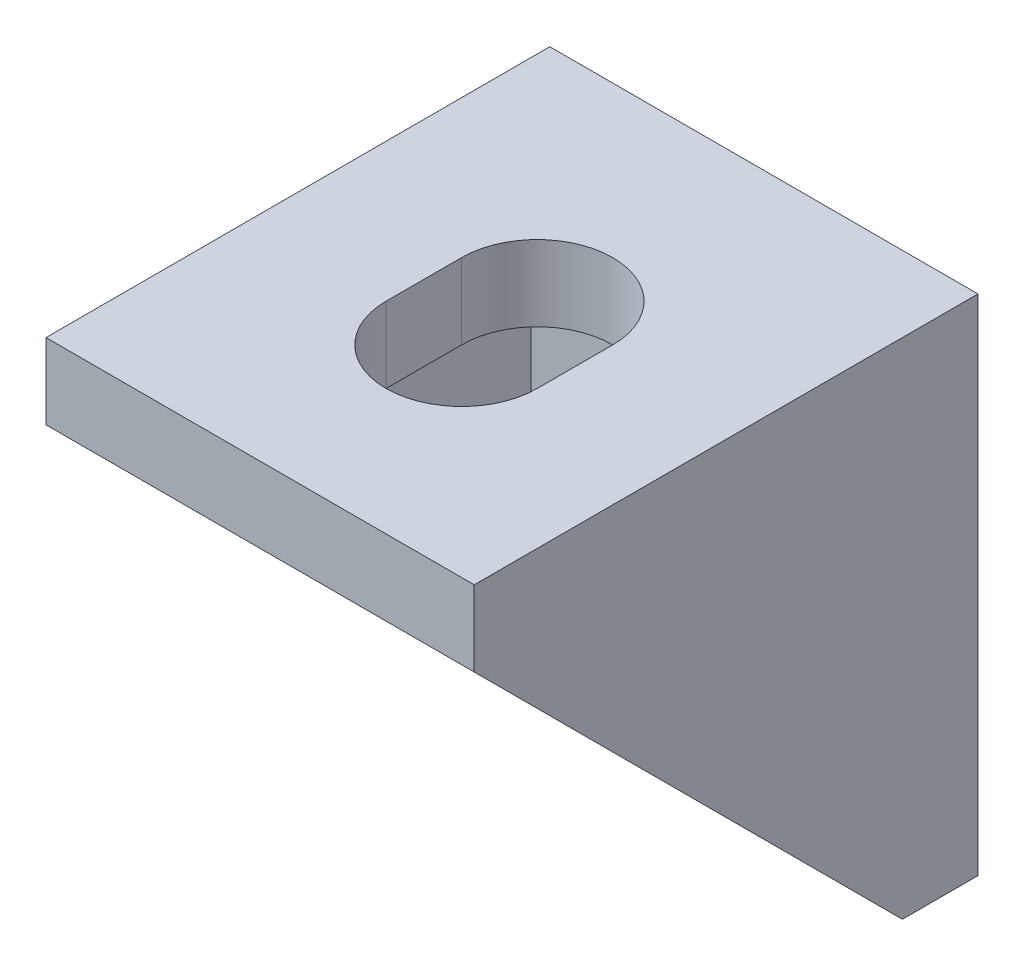
ISO-10303-21;
HEADER;
FILE_DESCRIPTION(('STEP AP214'),'2;1');
FILE_NAME('part.step','',(''),(''),'','','');
FILE_SCHEMA(('AUTOMOTIVE_DESIGN { 1 0 10303 214 1 1 1 1 }'));
ENDSEC;
DATA;
#1=APPLICATION_CONTEXT('core data for automotive mechanical design processes');
#2=APPLICATION_PROTOCOL_DEFINITION('international standard','automotive_design',2000,#1);
#3=PRODUCT_CONTEXT('',#1,'mechanical');
#4=PRODUCT('Part','Part','',(#3));
#5=PRODUCT_RELATED_PRODUCT_CATEGORY('part','',(#4));
#6=PRODUCT_DEFINITION_FORMATION('','',#4);
#7=PRODUCT_DEFINITION_CONTEXT('part definition',#1,'design');
#8=PRODUCT_DEFINITION('design','',#6,#7);
#9=PRODUCT_DEFINITION_SHAPE('','',#8);
#10=(LENGTH_UNIT() NAMED_UNIT(*) SI_UNIT(.MILLI.,.METRE.));
#11=(NAMED_UNIT(*) PLANE_ANGLE_UNIT() SI_UNIT($,.RADIAN.));
#12=(NAMED_UNIT(*) SI_UNIT($,.STERADIAN.) SOLID_ANGLE_UNIT());
#13=UNCERTAINTY_MEASURE_WITH_UNIT(LENGTH_MEASURE(1.E-05),#10,'distance_accuracy_value','');
#14=(GEOMETRIC_REPRESENTATION_CONTEXT(3) GLOBAL_UNCERTAINTY_ASSIGNED_CONTEXT((#13)) GLOBAL_UNIT_ASSIGNED_CONTEXT((#10,
#11,#12)) REPRESENTATION_CONTEXT('',''));
#15=CARTESIAN_POINT('',(0.,0.,0.));
#16=DIRECTION('',(0.,0.,1.));
#17=DIRECTION('',(1.,0.,0.));
#18=AXIS2_PLACEMENT_3D('',#15,#16,#17);
#19=CARTESIAN_POINT('',(0.,0.,3.));
#20=DIRECTION('',(0.,0.,1.));
#21=DIRECTION('',(1.,0.,0.));
#22=AXIS2_PLACEMENT_3D('',#19,#20,#21);
#23=PLANE('',#22);
#24=DIRECTION('',(0.,-1.,0.));
#25=VECTOR('',#24,1.);
#26=CARTESIAN_POINT('',(-23.775029160587,-3.31463022867131,3.));
#27=LINE('',#26,#25);
#28=CARTESIAN_POINT('',(-23.775029160587,-3.31463022867131,3.));
#29=VERTEX_POINT('',#28);
#30=CARTESIAN_POINT('',(-23.775029160587,-6.31463022867131,3.));
#31=VERTEX_POINT('',#30);
#32=EDGE_CURVE('E236',#29,#31,#27,.T.);
#33=ORIENTED_EDGE('',*,*,#32,.F.);
#34=CARTESIAN_POINT('',(-20.775029160587,-3.31463022867131,3.));
#35=DIRECTION('',(0.,0.,1.));
#36=DIRECTION('',(1.,0.,0.));
#37=AXIS2_PLACEMENT_3D('',#34,#35,#36);
#38=CIRCLE('',#37,3.);
#39=CARTESIAN_POINT('',(-17.775029160587,-3.31463022867131,3.));
#40=VERTEX_POINT('',#39);
#41=EDGE_CURVE('E234',#40,#29,#38,.T.);
#42=ORIENTED_EDGE('',*,*,#41,.F.);
#43=DIRECTION('',(0.,1.,0.));
#44=VECTOR('',#43,1.);
#45=CARTESIAN_POINT('',(-17.775029160587,-3.31463022867131,3.));
#46=LINE('',#45,#44);
#47=CARTESIAN_POINT('',(-17.775029160587,-6.31463022867131,3.));
#48=VERTEX_POINT('',#47);
#49=EDGE_CURVE('E242',#48,#40,#46,.T.);
#50=ORIENTED_EDGE('',*,*,#49,.F.);
#51=CARTESIAN_POINT('',(-20.775029160587,-6.31463022867131,3.));
#52=DIRECTION('',(0.,0.,1.));
#53=DIRECTION('',(1.,0.,0.));
#54=AXIS2_PLACEMENT_3D('',#51,#52,#53);
#55=CIRCLE('',#54,3.);
#56=EDGE_CURVE('E239',#31,#48,#55,.T.);
#57=ORIENTED_EDGE('',*,*,#56,.F.);
#58=EDGE_LOOP('',(#33,#42,#50,#57));
#59=FACE_BOUND('',#58,.T.);
#60=DIRECTION('',(1.,0.,0.));
#61=VECTOR('',#60,1.);
#62=CARTESIAN_POINT('',(-29.275029160587,-14.3146302286713,3.));
#63=LINE('',#62,#61);
#64=CARTESIAN_POINT('',(-27.025029160587,-14.3146302286713,3.));
#65=VERTEX_POINT('',#64);
#66=CARTESIAN_POINT('',(-14.525029160587,-14.3146302286713,3.));
#67=VERTEX_POINT('',#66);
#68=EDGE_CURVE('E173',#65,#67,#63,.T.);
#69=ORIENTED_EDGE('',*,*,#68,.T.);
#70=DIRECTION('',(0.,1.,0.));
#71=VECTOR('',#70,1.);
#72=CARTESIAN_POINT('',(-14.525029160587,-14.3146302286713,3.));
#73=LINE('',#72,#71);
#74=CARTESIAN_POINT('',(-14.525029160587,2.68536977132869,3.));
#75=VERTEX_POINT('',#74);
#76=EDGE_CURVE('E148',#67,#75,#73,.T.);
#77=ORIENTED_EDGE('',*,*,#76,.T.);
#78=DIRECTION('',(1.,0.,0.));
#79=VECTOR('',#78,1.);
#80=CARTESIAN_POINT('',(-12.275029160587,2.68536977132869,3.));
#81=LINE('',#80,#79);
#82=CARTESIAN_POINT('',(-27.025029160587,2.68536977132869,3.));
#83=VERTEX_POINT('',#82);
#84=EDGE_CURVE('E231',#83,#75,#81,.T.);
#85=ORIENTED_EDGE('',*,*,#84,.F.);
#86=DIRECTION('',(0.,-1.,0.));
#87=VECTOR('',#86,1.);
#88=CARTESIAN_POINT('',(-27.025029160587,2.68536977132869,3.));
#89=LINE('',#88,#87);
#90=EDGE_CURVE('E177',#83,#65,#89,.T.);
#91=ORIENTED_EDGE('',*,*,#90,.T.);
#92=EDGE_LOOP('',(#69,#77,#85,#91));
#93=FACE_BOUND('',#92,.T.);
#94=ADVANCED_FACE('F35',(#59,#93),#23,.T.);
#95=CARTESIAN_POINT('',(-12.275029160587,2.68536977132869,20.));
#96=DIRECTION('',(0.,1.,0.));
#97=DIRECTION('',(-1.,0.,0.));
#98=AXIS2_PLACEMENT_3D('',#95,#96,#97);
#99=PLANE('',#98);
#100=DIRECTION('',(0.,0.,-1.));
#101=VECTOR('',#100,1.);
#102=CARTESIAN_POINT('',(-23.775029160587,2.68536977132869,12.));
#103=LINE('',#102,#101);
#104=CARTESIAN_POINT('',(-23.775029160587,2.68536977132869,12.));
#105=VERTEX_POINT('',#104);
#106=CARTESIAN_POINT('',(-23.775029160587,2.68536977132869,9.00000000000001));
#107=VERTEX_POINT('',#106);
#108=EDGE_CURVE('E413',#105,#107,#103,.T.);
#109=ORIENTED_EDGE('',*,*,#108,.F.);
#110=CARTESIAN_POINT('',(-20.775029160587,2.68536977132869,12.));
#111=DIRECTION('',(0.,-1.,0.));
#112=DIRECTION('',(1.,0.,0.));
#113=AXIS2_PLACEMENT_3D('',#110,#111,#112);
#114=CIRCLE('',#113,3.);
#115=CARTESIAN_POINT('',(-17.775029160587,2.68536977132869,12.));
#116=VERTEX_POINT('',#115);
#117=EDGE_CURVE('E396',#116,#105,#114,.T.);
#118=ORIENTED_EDGE('',*,*,#117,.F.);
#119=DIRECTION('',(0.,0.,1.));
#120=VECTOR('',#119,1.);
#121=CARTESIAN_POINT('',(-17.775029160587,2.68536977132869,12.));
#122=LINE('',#121,#120);
#123=CARTESIAN_POINT('',(-17.775029160587,2.68536977132869,9.00000000000001));
#124=VERTEX_POINT('',#123);
#125=EDGE_CURVE('E404',#124,#116,#122,.T.);
#126=ORIENTED_EDGE('',*,*,#125,.F.);
#127=CARTESIAN_POINT('',(-20.775029160587,2.68536977132869,9.00000000000001));
#128=DIRECTION('',(0.,-1.,0.));
#129=DIRECTION('',(1.,0.,0.));
#130=AXIS2_PLACEMENT_3D('',#127,#128,#129);
#131=CIRCLE('',#130,3.);
#132=EDGE_CURVE('E409',#107,#124,#131,.T.);
#133=ORIENTED_EDGE('',*,*,#132,.F.);
#134=EDGE_LOOP('',(#109,#118,#126,#133));
#135=FACE_BOUND('',#134,.T.);
#136=DIRECTION('',(0.,0.,1.));
#137=VECTOR('',#136,1.);
#138=CARTESIAN_POINT('',(-14.525029160587,2.68536977132869,3.));
#139=LINE('',#138,#137);
#140=CARTESIAN_POINT('',(-14.525029160587,2.68536977132869,20.));
#141=VERTEX_POINT('',#140);
#142=EDGE_CURVE('E153',#75,#141,#139,.T.);
#143=ORIENTED_EDGE('',*,*,#142,.T.);
#144=DIRECTION('',(1.,0.,0.));
#145=VECTOR('',#144,1.);
#146=CARTESIAN_POINT('',(-12.275029160587,2.68536977132869,20.));
#147=LINE('',#146,#145);
#148=CARTESIAN_POINT('',(-27.025029160587,2.68536977132869,20.));
#149=VERTEX_POINT('',#148);
#150=EDGE_CURVE('E220',#149,#141,#147,.T.);
#151=ORIENTED_EDGE('',*,*,#150,.F.);
#152=DIRECTION('',(0.,0.,-1.));
#153=VECTOR('',#152,1.);
#154=CARTESIAN_POINT('',(-27.025029160587,2.68536977132869,20.));
#155=LINE('',#154,#153);
#156=EDGE_CURVE('E416',#149,#83,#155,.T.);
#157=ORIENTED_EDGE('',*,*,#156,.T.);
#158=ORIENTED_EDGE('',*,*,#84,.T.);
#159=EDGE_LOOP('',(#143,#151,#157,#158));
#160=FACE_BOUND('',#159,.T.);
#161=ADVANCED_FACE('F288',(#135,#160),#99,.F.);
#162=CARTESIAN_POINT('',(0.,0.,0.));
#163=DIRECTION('',(0.,0.,1.));
#164=DIRECTION('',(1.,0.,0.));
#165=AXIS2_PLACEMENT_3D('',#162,#163,#164);
#166=PLANE('',#165);
#167=DIRECTION('',(0.,-1.,0.));
#168=VECTOR('',#167,1.);
#169=CARTESIAN_POINT('',(-29.275029160587,5.68536977132869,0.));
#170=LINE('',#169,#168);
#171=CARTESIAN_POINT('',(-29.275029160587,5.68536977132869,0.));
#172=VERTEX_POINT('',#171);
#173=CARTESIAN_POINT('',(-29.275029160587,-14.3146302286713,0.));
#174=VERTEX_POINT('',#173);
#175=EDGE_CURVE('E188',#172,#174,#170,.T.);
#176=ORIENTED_EDGE('',*,*,#175,.F.);
#177=DIRECTION('',(-1.,0.,0.));
#178=VECTOR('',#177,1.);
#179=CARTESIAN_POINT('',(-29.275029160587,5.68536977132869,0.));
#180=LINE('',#179,#178);
#181=CARTESIAN_POINT('',(-12.275029160587,5.68536977132869,0.));
#182=VERTEX_POINT('',#181);
#183=EDGE_CURVE('E179',#182,#172,#180,.T.);
#184=ORIENTED_EDGE('',*,*,#183,.F.);
#185=DIRECTION('',(0.,1.,0.));
#186=VECTOR('',#185,1.);
#187=CARTESIAN_POINT('',(-12.275029160587,5.68536977132869,0.));
#188=LINE('',#187,#186);
#189=CARTESIAN_POINT('',(-12.275029160587,-14.3146302286713,0.));
#190=VERTEX_POINT('',#189);
#191=EDGE_CURVE('E182',#190,#182,#188,.T.);
#192=ORIENTED_EDGE('',*,*,#191,.F.);
#193=DIRECTION('',(1.,0.,0.));
#194=VECTOR('',#193,1.);
#195=CARTESIAN_POINT('',(-29.275029160587,-14.3146302286713,0.));
#196=LINE('',#195,#194);
#197=EDGE_CURVE('E191',#174,#190,#196,.T.);
#198=ORIENTED_EDGE('',*,*,#197,.F.);
#199=EDGE_LOOP('',(#176,#184,#192,#198));
#200=FACE_BOUND('',#199,.T.);
#201=CARTESIAN_POINT('',(-20.775029160587,-3.31463022867131,0.));
#202=DIRECTION('',(0.,0.,1.));
#203=DIRECTION('',(1.,0.,0.));
#204=AXIS2_PLACEMENT_3D('',#201,#202,#203);
#205=CIRCLE('',#204,3.);
#206=CARTESIAN_POINT('',(-17.775029160587,-3.31463022867131,0.));
#207=VERTEX_POINT('',#206);
#208=CARTESIAN_POINT('',(-23.775029160587,-3.31463022867131,0.));
#209=VERTEX_POINT('',#208);
#210=EDGE_CURVE('E230',#207,#209,#205,.T.);
#211=ORIENTED_EDGE('',*,*,#210,.T.);
#212=DIRECTION('',(0.,-1.,0.));
#213=VECTOR('',#212,1.);
#214=CARTESIAN_POINT('',(-23.775029160587,-3.31463022867131,0.));
#215=LINE('',#214,#213);
#216=CARTESIAN_POINT('',(-23.775029160587,-6.31463022867131,0.));
#217=VERTEX_POINT('',#216);
#218=EDGE_CURVE('E247',#209,#217,#215,.T.);
#219=ORIENTED_EDGE('',*,*,#218,.T.);
#220=CARTESIAN_POINT('',(-20.775029160587,-6.31463022867131,0.));
#221=DIRECTION('',(0.,0.,1.));
#222=DIRECTION('',(1.,0.,0.));
#223=AXIS2_PLACEMENT_3D('',#220,#221,#222);
#224=CIRCLE('',#223,3.);
#225=CARTESIAN_POINT('',(-17.775029160587,-6.31463022867131,0.));
#226=VERTEX_POINT('',#225);
#227=EDGE_CURVE('E250',#217,#226,#224,.T.);
#228=ORIENTED_EDGE('',*,*,#227,.T.);
#229=DIRECTION('',(0.,1.,0.));
#230=VECTOR('',#229,1.);
#231=CARTESIAN_POINT('',(-17.775029160587,-3.31463022867131,0.));
#232=LINE('',#231,#230);
#233=EDGE_CURVE('E237',#226,#207,#232,.T.);
#234=ORIENTED_EDGE('',*,*,#233,.T.);
#235=EDGE_LOOP('',(#211,#219,#228,#234));
#236=FACE_BOUND('',#235,.T.);
#237=ADVANCED_FACE('F205',(#200,#236),#166,.F.);
#238=CARTESIAN_POINT('',(-29.275029160587,5.68536977132869,3.));
#239=DIRECTION('',(1.,0.,0.));
#240=DIRECTION('',(0.,1.,0.));
#241=AXIS2_PLACEMENT_3D('',#238,#239,#240);
#242=PLANE('',#241);
#243=DIRECTION('',(0.,0.,-1.));
#244=VECTOR('',#243,1.);
#245=CARTESIAN_POINT('',(-29.275029160587,-14.3146302286713,3.));
#246=LINE('',#245,#244);
#247=CARTESIAN_POINT('',(-29.275029160587,-14.3146302286713,3.));
#248=VERTEX_POINT('',#247);
#249=EDGE_CURVE('E11',#248,#174,#246,.T.);
#250=ORIENTED_EDGE('',*,*,#249,.F.);
#251=DIRECTION('',(0.,0.707106781186547,0.707106781186548));
#252=VECTOR('',#251,1.);
#253=CARTESIAN_POINT('',(-29.275029160587,-14.3146302286713,3.));
#254=LINE('',#253,#252);
#255=CARTESIAN_POINT('',(-29.275029160587,2.68536977132869,20.));
#256=VERTEX_POINT('',#255);
#257=EDGE_CURVE('E217',#248,#256,#254,.T.);
#258=ORIENTED_EDGE('',*,*,#257,.T.);
#259=DIRECTION('',(0.,-1.,0.));
#260=VECTOR('',#259,1.);
#261=CARTESIAN_POINT('',(-29.275029160587,5.68536977132869,20.));
#262=LINE('',#261,#260);
#263=CARTESIAN_POINT('',(-29.275029160587,5.68536977132869,20.));
#264=VERTEX_POINT('',#263);
#265=EDGE_CURVE('E216',#264,#256,#262,.T.);
#266=ORIENTED_EDGE('',*,*,#265,.F.);
#267=DIRECTION('',(0.,0.,-1.));
#268=VECTOR('',#267,1.);
#269=CARTESIAN_POINT('',(-29.275029160587,5.68536977132869,3.));
#270=LINE('',#269,#268);
#271=EDGE_CURVE('E181',#264,#172,#270,.T.);
#272=ORIENTED_EDGE('',*,*,#271,.T.);
#273=ORIENTED_EDGE('',*,*,#175,.T.);
#274=EDGE_LOOP('',(#250,#258,#266,#272,#273));
#275=FACE_BOUND('',#274,.T.);
#276=ADVANCED_FACE('F37',(#275),#242,.F.);
#277=CARTESIAN_POINT('',(-29.275029160587,-14.3146302286713,3.));
#278=DIRECTION('',(0.,1.,0.));
#279=DIRECTION('',(0.,0.,1.));
#280=AXIS2_PLACEMENT_3D('',#277,#278,#279);
#281=PLANE('',#280);
#282=ORIENTED_EDGE('',*,*,#197,.T.);
#283=DIRECTION('',(0.,0.,-1.));
#284=VECTOR('',#283,1.);
#285=CARTESIAN_POINT('',(-12.275029160587,-14.3146302286713,3.));
#286=LINE('',#285,#284);
#287=CARTESIAN_POINT('',(-12.275029160587,-14.3146302286713,3.));
#288=VERTEX_POINT('',#287);
#289=EDGE_CURVE('E43',#288,#190,#286,.T.);
#290=ORIENTED_EDGE('',*,*,#289,.F.);
#291=DIRECTION('',(1.,0.,0.));
#292=VECTOR('',#291,1.);
#293=CARTESIAN_POINT('',(-14.525029160587,-14.3146302286713,3.));
#294=LINE('',#293,#292);
#295=EDGE_CURVE('E162',#67,#288,#294,.T.);
#296=ORIENTED_EDGE('',*,*,#295,.F.);
#297=ORIENTED_EDGE('',*,*,#68,.F.);
#298=EDGE_CURVE('E178',#248,#65,#63,.T.);
#299=ORIENTED_EDGE('',*,*,#298,.F.);
#300=ORIENTED_EDGE('',*,*,#249,.T.);
#301=EDGE_LOOP('',(#282,#290,#296,#297,#299,#300));
#302=FACE_BOUND('',#301,.T.);
#303=ADVANCED_FACE('F171',(#302),#281,.F.);
#304=CARTESIAN_POINT('',(-12.275029160587,5.68536977132869,3.));
#305=DIRECTION('',(-1.,0.,0.));
#306=DIRECTION('',(0.,-1.,0.));
#307=AXIS2_PLACEMENT_3D('',#304,#305,#306);
#308=PLANE('',#307);
#309=ORIENTED_EDGE('',*,*,#191,.T.);
#310=DIRECTION('',(0.,0.,-1.));
#311=VECTOR('',#310,1.);
#312=CARTESIAN_POINT('',(-12.275029160587,5.68536977132869,3.));
#313=LINE('',#312,#311);
#314=CARTESIAN_POINT('',(-12.275029160587,5.68536977132869,20.));
#315=VERTEX_POINT('',#314);
#316=EDGE_CURVE('E196',#315,#182,#313,.T.);
#317=ORIENTED_EDGE('',*,*,#316,.F.);
#318=DIRECTION('',(0.,1.,0.));
#319=VECTOR('',#318,1.);
#320=CARTESIAN_POINT('',(-12.275029160587,5.68536977132869,20.));
#321=LINE('',#320,#319);
#322=CARTESIAN_POINT('',(-12.275029160587,2.68536977132869,20.));
#323=VERTEX_POINT('',#322);
#324=EDGE_CURVE('E226',#323,#315,#321,.T.);
#325=ORIENTED_EDGE('',*,*,#324,.F.);
#326=DIRECTION('',(0.,-0.707106781186547,-0.707106781186547));
#327=VECTOR('',#326,1.);
#328=CARTESIAN_POINT('',(-12.275029160587,2.68536977132869,20.));
#329=LINE('',#328,#327);
#330=EDGE_CURVE('E166',#323,#288,#329,.T.);
#331=ORIENTED_EDGE('',*,*,#330,.T.);
#332=ORIENTED_EDGE('',*,*,#289,.T.);
#333=EDGE_LOOP('',(#309,#317,#325,#331,#332));
#334=FACE_BOUND('',#333,.T.);
#335=ADVANCED_FACE('F200',(#334),#308,.F.);
#336=CARTESIAN_POINT('',(-29.275029160587,5.68536977132869,3.));
#337=DIRECTION('',(0.,-1.,0.));
#338=DIRECTION('',(0.,0.,-1.));
#339=AXIS2_PLACEMENT_3D('',#336,#337,#338);
#340=PLANE('',#339);
#341=DIRECTION('',(0.,0.,1.));
#342=VECTOR('',#341,1.);
#343=CARTESIAN_POINT('',(-17.775029160587,5.68536977132869,3.));
#344=LINE('',#343,#342);
#345=CARTESIAN_POINT('',(-17.775029160587,5.68536977132869,9.00000000000001));
#346=VERTEX_POINT('',#345);
#347=CARTESIAN_POINT('',(-17.775029160587,5.68536977132869,12.));
#348=VERTEX_POINT('',#347);
#349=EDGE_CURVE('E429',#346,#348,#344,.T.);
#350=ORIENTED_EDGE('',*,*,#349,.T.);
#351=CARTESIAN_POINT('',(-20.775029160587,5.68536977132869,12.));
#352=DIRECTION('',(0.,-1.,0.));
#353=DIRECTION('',(0.,0.,-1.));
#354=AXIS2_PLACEMENT_3D('',#351,#352,#353);
#355=CIRCLE('',#354,3.);
#356=CARTESIAN_POINT('',(-23.775029160587,5.68536977132869,12.));
#357=VERTEX_POINT('',#356);
#358=EDGE_CURVE('E233',#348,#357,#355,.T.);
#359=ORIENTED_EDGE('',*,*,#358,.T.);
#360=DIRECTION('',(0.,0.,-1.));
#361=VECTOR('',#360,1.);
#362=CARTESIAN_POINT('',(-23.775029160587,5.68536977132869,3.));
#363=LINE('',#362,#361);
#364=CARTESIAN_POINT('',(-23.775029160587,5.68536977132869,9.00000000000001));
#365=VERTEX_POINT('',#364);
#366=EDGE_CURVE('E400',#357,#365,#363,.T.);
#367=ORIENTED_EDGE('',*,*,#366,.T.);
#368=CARTESIAN_POINT('',(-20.775029160587,5.68536977132869,9.00000000000001));
#369=DIRECTION('',(0.,-1.,0.));
#370=DIRECTION('',(0.,0.,-1.));
#371=AXIS2_PLACEMENT_3D('',#368,#369,#370);
#372=CIRCLE('',#371,3.);
#373=EDGE_CURVE('E426',#365,#346,#372,.T.);
#374=ORIENTED_EDGE('',*,*,#373,.T.);
#375=EDGE_LOOP('',(#350,#359,#367,#374));
#376=FACE_BOUND('',#375,.T.);
#377=ORIENTED_EDGE('',*,*,#183,.T.);
#378=ORIENTED_EDGE('',*,*,#271,.F.);
#379=DIRECTION('',(-1.,0.,0.));
#380=VECTOR('',#379,1.);
#381=CARTESIAN_POINT('',(-12.275029160587,5.68536977132869,20.));
#382=LINE('',#381,#380);
#383=EDGE_CURVE('E221',#315,#264,#382,.T.);
#384=ORIENTED_EDGE('',*,*,#383,.F.);
#385=ORIENTED_EDGE('',*,*,#316,.T.);
#386=EDGE_LOOP('',(#377,#378,#384,#385));
#387=FACE_BOUND('',#386,.T.);
#388=ADVANCED_FACE('F208',(#376,#387),#340,.F.);
#389=CARTESIAN_POINT('',(-20.775029160587,-3.31463022867131,3.));
#390=DIRECTION('',(0.,0.,-1.));
#391=DIRECTION('',(-1.,0.,0.));
#392=AXIS2_PLACEMENT_3D('',#389,#390,#391);
#393=CYLINDRICAL_SURFACE('',#392,3.);
#394=ORIENTED_EDGE('',*,*,#210,.F.);
#395=DIRECTION('',(0.,0.,-1.));
#396=VECTOR('',#395,1.);
#397=CARTESIAN_POINT('',(-17.775029160587,-3.31463022867131,3.));
#398=LINE('',#397,#396);
#399=EDGE_CURVE('E244',#40,#207,#398,.T.);
#400=ORIENTED_EDGE('',*,*,#399,.F.);
#401=ORIENTED_EDGE('',*,*,#41,.T.);
#402=DIRECTION('',(0.,0.,-1.));
#403=VECTOR('',#402,1.);
#404=CARTESIAN_POINT('',(-23.775029160587,-3.31463022867131,3.));
#405=LINE('',#404,#403);
#406=EDGE_CURVE('E186',#29,#209,#405,.T.);
#407=ORIENTED_EDGE('',*,*,#406,.T.);
#408=EDGE_LOOP('',(#394,#400,#401,#407));
#409=FACE_BOUND('',#408,.T.);
#410=ADVANCED_FACE('F265',(#409),#393,.F.);
#411=CARTESIAN_POINT('',(-23.775029160587,-3.31463022867131,3.));
#412=DIRECTION('',(1.,0.,0.));
#413=DIRECTION('',(0.,0.,-1.));
#414=AXIS2_PLACEMENT_3D('',#411,#412,#413);
#415=PLANE('',#414);
#416=ORIENTED_EDGE('',*,*,#218,.F.);
#417=ORIENTED_EDGE('',*,*,#406,.F.);
#418=ORIENTED_EDGE('',*,*,#32,.T.);
#419=DIRECTION('',(0.,0.,-1.));
#420=VECTOR('',#419,1.);
#421=CARTESIAN_POINT('',(-23.775029160587,-6.31463022867131,3.));
#422=LINE('',#421,#420);
#423=EDGE_CURVE('E258',#31,#217,#422,.T.);
#424=ORIENTED_EDGE('',*,*,#423,.T.);
#425=EDGE_LOOP('',(#416,#417,#418,#424));
#426=FACE_BOUND('',#425,.T.);
#427=ADVANCED_FACE('F275',(#426),#415,.T.);
#428=CARTESIAN_POINT('',(-20.775029160587,-6.31463022867131,3.));
#429=DIRECTION('',(0.,0.,-1.));
#430=DIRECTION('',(-1.,0.,0.));
#431=AXIS2_PLACEMENT_3D('',#428,#429,#430);
#432=CYLINDRICAL_SURFACE('',#431,3.);
#433=ORIENTED_EDGE('',*,*,#227,.F.);
#434=ORIENTED_EDGE('',*,*,#423,.F.);
#435=ORIENTED_EDGE('',*,*,#56,.T.);
#436=DIRECTION('',(0.,0.,-1.));
#437=VECTOR('',#436,1.);
#438=CARTESIAN_POINT('',(-17.775029160587,-6.31463022867131,3.));
#439=LINE('',#438,#437);
#440=EDGE_CURVE('E257',#48,#226,#439,.T.);
#441=ORIENTED_EDGE('',*,*,#440,.T.);
#442=EDGE_LOOP('',(#433,#434,#435,#441));
#443=FACE_BOUND('',#442,.T.);
#444=ADVANCED_FACE('F277',(#443),#432,.F.);
#445=CARTESIAN_POINT('',(-17.775029160587,-3.31463022867131,3.));
#446=DIRECTION('',(-1.,0.,0.));
#447=DIRECTION('',(0.,0.,1.));
#448=AXIS2_PLACEMENT_3D('',#445,#446,#447);
#449=PLANE('',#448);
#450=ORIENTED_EDGE('',*,*,#233,.F.);
#451=ORIENTED_EDGE('',*,*,#440,.F.);
#452=ORIENTED_EDGE('',*,*,#49,.T.);
#453=ORIENTED_EDGE('',*,*,#399,.T.);
#454=EDGE_LOOP('',(#450,#451,#452,#453));
#455=FACE_BOUND('',#454,.T.);
#456=ADVANCED_FACE('F271',(#455),#449,.T.);
#457=CARTESIAN_POINT('',(0.,0.,20.));
#458=DIRECTION('',(0.,0.,-1.));
#459=DIRECTION('',(-1.,0.,0.));
#460=AXIS2_PLACEMENT_3D('',#457,#458,#459);
#461=PLANE('',#460);
#462=ORIENTED_EDGE('',*,*,#324,.T.);
#463=ORIENTED_EDGE('',*,*,#383,.T.);
#464=ORIENTED_EDGE('',*,*,#265,.T.);
#465=EDGE_CURVE('E224',#256,#149,#147,.T.);
#466=ORIENTED_EDGE('',*,*,#465,.T.);
#467=ORIENTED_EDGE('',*,*,#150,.T.);
#468=DIRECTION('',(1.,0.,0.));
#469=VECTOR('',#468,1.);
#470=CARTESIAN_POINT('',(-14.525029160587,2.68536977132869,20.));
#471=LINE('',#470,#469);
#472=EDGE_CURVE('E165',#141,#323,#471,.T.);
#473=ORIENTED_EDGE('',*,*,#472,.T.);
#474=EDGE_LOOP('',(#462,#463,#464,#466,#467,#473));
#475=FACE_BOUND('',#474,.T.);
#476=ADVANCED_FACE('F284',(#475),#461,.F.);
#477=CARTESIAN_POINT('',(-20.775029160587,19.6853697713287,12.));
#478=DIRECTION('',(0.,-1.,0.));
#479=DIRECTION('',(1.,0.,0.));
#480=AXIS2_PLACEMENT_3D('',#477,#478,#479);
#481=CYLINDRICAL_SURFACE('',#480,3.);
#482=DIRECTION('',(0.,-1.,0.));
#483=VECTOR('',#482,1.);
#484=CARTESIAN_POINT('',(-17.775029160587,19.6853697713287,12.));
#485=LINE('',#484,#483);
#486=EDGE_CURVE('E392',#348,#116,#485,.T.);
#487=ORIENTED_EDGE('',*,*,#486,.T.);
#488=ORIENTED_EDGE('',*,*,#117,.T.);
#489=DIRECTION('',(0.,-1.,0.));
#490=VECTOR('',#489,1.);
#491=CARTESIAN_POINT('',(-23.775029160587,19.6853697713287,12.));
#492=LINE('',#491,#490);
#493=EDGE_CURVE('E408',#357,#105,#492,.T.);
#494=ORIENTED_EDGE('',*,*,#493,.F.);
#495=ORIENTED_EDGE('',*,*,#358,.F.);
#496=EDGE_LOOP('',(#487,#488,#494,#495));
#497=FACE_BOUND('',#496,.T.);
#498=ADVANCED_FACE('F347',(#497),#481,.F.);
#499=CARTESIAN_POINT('',(-17.775029160587,19.6853697713287,12.));
#500=DIRECTION('',(1.,0.,0.));
#501=DIRECTION('',(0.,1.,0.));
#502=AXIS2_PLACEMENT_3D('',#499,#500,#501);
#503=PLANE('',#502);
#504=DIRECTION('',(0.,-1.,0.));
#505=VECTOR('',#504,1.);
#506=CARTESIAN_POINT('',(-17.775029160587,19.6853697713287,9.00000000000001));
#507=LINE('',#506,#505);
#508=EDGE_CURVE('E401',#346,#124,#507,.T.);
#509=ORIENTED_EDGE('',*,*,#508,.T.);
#510=ORIENTED_EDGE('',*,*,#125,.T.);
#511=ORIENTED_EDGE('',*,*,#486,.F.);
#512=ORIENTED_EDGE('',*,*,#349,.F.);
#513=EDGE_LOOP('',(#509,#510,#511,#512));
#514=FACE_BOUND('',#513,.T.);
#515=ADVANCED_FACE('F378',(#514),#503,.F.);
#516=CARTESIAN_POINT('',(-20.775029160587,19.6853697713287,9.00000000000001));
#517=DIRECTION('',(0.,-1.,0.));
#518=DIRECTION('',(1.,0.,0.));
#519=AXIS2_PLACEMENT_3D('',#516,#517,#518);
#520=CYLINDRICAL_SURFACE('',#519,3.);
#521=DIRECTION('',(0.,-1.,0.));
#522=VECTOR('',#521,1.);
#523=CARTESIAN_POINT('',(-23.775029160587,19.6853697713287,9.00000000000001));
#524=LINE('',#523,#522);
#525=EDGE_CURVE('E58',#365,#107,#524,.T.);
#526=ORIENTED_EDGE('',*,*,#525,.T.);
#527=ORIENTED_EDGE('',*,*,#132,.T.);
#528=ORIENTED_EDGE('',*,*,#508,.F.);
#529=ORIENTED_EDGE('',*,*,#373,.F.);
#530=EDGE_LOOP('',(#526,#527,#528,#529));
#531=FACE_BOUND('',#530,.T.);
#532=ADVANCED_FACE('F381',(#531),#520,.F.);
#533=CARTESIAN_POINT('',(-23.775029160587,19.6853697713287,12.));
#534=DIRECTION('',(-1.,0.,0.));
#535=DIRECTION('',(0.,-1.,0.));
#536=AXIS2_PLACEMENT_3D('',#533,#534,#535);
#537=PLANE('',#536);
#538=ORIENTED_EDGE('',*,*,#493,.T.);
#539=ORIENTED_EDGE('',*,*,#108,.T.);
#540=ORIENTED_EDGE('',*,*,#525,.F.);
#541=ORIENTED_EDGE('',*,*,#366,.F.);
#542=EDGE_LOOP('',(#538,#539,#540,#541));
#543=FACE_BOUND('',#542,.T.);
#544=ADVANCED_FACE('F377',(#543),#537,.F.);
#545=CARTESIAN_POINT('',(-27.025029160587,-14.3146302286713,3.));
#546=DIRECTION('',(0.,-0.707106781186548,0.707106781186547));
#547=DIRECTION('',(0.,-0.707106781186547,-0.707106781186548));
#548=AXIS2_PLACEMENT_3D('',#545,#546,#547);
#549=PLANE('',#548);
#550=ORIENTED_EDGE('',*,*,#257,.F.);
#551=ORIENTED_EDGE('',*,*,#298,.T.);
#552=DIRECTION('',(0.,0.707106781186547,0.707106781186548));
#553=VECTOR('',#552,1.);
#554=CARTESIAN_POINT('',(-27.025029160587,-14.3146302286713,3.));
#555=LINE('',#554,#553);
#556=EDGE_CURVE('E50',#65,#149,#555,.T.);
#557=ORIENTED_EDGE('',*,*,#556,.T.);
#558=ORIENTED_EDGE('',*,*,#465,.F.);
#559=EDGE_LOOP('',(#550,#551,#557,#558));
#560=FACE_BOUND('',#559,.T.);
#561=ADVANCED_FACE('F373',(#560),#549,.T.);
#562=CARTESIAN_POINT('',(-27.025029160587,0.,0.));
#563=DIRECTION('',(-1.,0.,0.));
#564=DIRECTION('',(0.,-1.,0.));
#565=AXIS2_PLACEMENT_3D('',#562,#563,#564);
#566=PLANE('',#565);
#567=ORIENTED_EDGE('',*,*,#556,.F.);
#568=ORIENTED_EDGE('',*,*,#90,.F.);
#569=ORIENTED_EDGE('',*,*,#156,.F.);
#570=EDGE_LOOP('',(#567,#568,#569));
#571=FACE_BOUND('',#570,.T.);
#572=ADVANCED_FACE('F358',(#571),#566,.F.);
#573=CARTESIAN_POINT('',(-14.525029160587,2.68536977132869,20.));
#574=DIRECTION('',(0.,-0.707106781186547,0.707106781186547));
#575=DIRECTION('',(0.,-0.707106781186548,-0.707106781186548));
#576=AXIS2_PLACEMENT_3D('',#573,#574,#575);
#577=PLANE('',#576);
#578=ORIENTED_EDGE('',*,*,#330,.F.);
#579=ORIENTED_EDGE('',*,*,#472,.F.);
#580=DIRECTION('',(0.,-0.707106781186547,-0.707106781186547));
#581=VECTOR('',#580,1.);
#582=CARTESIAN_POINT('',(-14.525029160587,2.68536977132869,20.));
#583=LINE('',#582,#581);
#584=EDGE_CURVE('E151',#141,#67,#583,.T.);
#585=ORIENTED_EDGE('',*,*,#584,.T.);
#586=ORIENTED_EDGE('',*,*,#295,.T.);
#587=EDGE_LOOP('',(#578,#579,#585,#586));
#588=FACE_BOUND('',#587,.T.);
#589=ADVANCED_FACE('F161',(#588),#577,.T.);
#590=CARTESIAN_POINT('',(-14.525029160587,0.,0.));
#591=DIRECTION('',(1.,0.,0.));
#592=DIRECTION('',(0.,1.,0.));
#593=AXIS2_PLACEMENT_3D('',#590,#591,#592);
#594=PLANE('',#593);
#595=ORIENTED_EDGE('',*,*,#584,.F.);
#596=ORIENTED_EDGE('',*,*,#142,.F.);
#597=ORIENTED_EDGE('',*,*,#76,.F.);
#598=EDGE_LOOP('',(#595,#596,#597));
#599=FACE_BOUND('',#598,.T.);
#600=ADVANCED_FACE('F150',(#599),#594,.F.);
#601=CLOSED_SHELL('',(#94,#161,#237,#276,#303,#335,#388,#410,#427,#444,#456,#476,#498,#515,#532,
#544,#561,#572,#589,#600));
#602=MANIFOLD_SOLID_BREP('B2',#601);
#603=ADVANCED_BREP_SHAPE_REPRESENTATION('',(#18,#602),#14);
#604=SHAPE_DEFINITION_REPRESENTATION(#9,#603);
ENDSEC;
END-ISO-10303-21;
